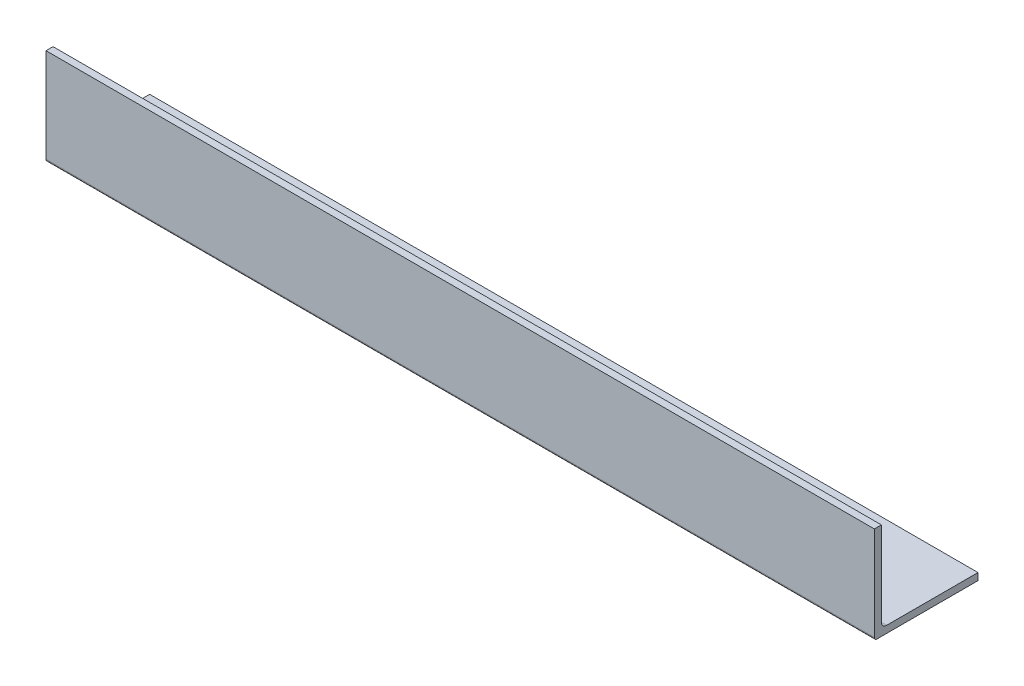
ISO-10303-21;
HEADER;
FILE_DESCRIPTION(('STEP AP214'),'2;1');
FILE_NAME('part.step','',(''),(''),'','','');
FILE_SCHEMA(('AUTOMOTIVE_DESIGN { 1 0 10303 214 1 1 1 1 }'));
ENDSEC;
DATA;
#1=APPLICATION_CONTEXT('core data for automotive mechanical design processes');
#2=APPLICATION_PROTOCOL_DEFINITION('international standard','automotive_design',2000,#1);
#3=PRODUCT_CONTEXT('',#1,'mechanical');
#4=PRODUCT('Part','Part','',(#3));
#5=PRODUCT_RELATED_PRODUCT_CATEGORY('part','',(#4));
#6=PRODUCT_DEFINITION_FORMATION('','',#4);
#7=PRODUCT_DEFINITION_CONTEXT('part definition',#1,'design');
#8=PRODUCT_DEFINITION('design','',#6,#7);
#9=PRODUCT_DEFINITION_SHAPE('','',#8);
#10=(LENGTH_UNIT() NAMED_UNIT(*) SI_UNIT(.MILLI.,.METRE.));
#11=(NAMED_UNIT(*) PLANE_ANGLE_UNIT() SI_UNIT($,.RADIAN.));
#12=(NAMED_UNIT(*) SI_UNIT($,.STERADIAN.) SOLID_ANGLE_UNIT());
#13=UNCERTAINTY_MEASURE_WITH_UNIT(LENGTH_MEASURE(1.E-05),#10,'distance_accuracy_value','');
#14=(GEOMETRIC_REPRESENTATION_CONTEXT(3) GLOBAL_UNCERTAINTY_ASSIGNED_CONTEXT((#13)) GLOBAL_UNIT_ASSIGNED_CONTEXT((#10,
#11,#12)) REPRESENTATION_CONTEXT('',''));
#15=CARTESIAN_POINT('',(0.,0.,0.));
#16=DIRECTION('',(0.,0.,1.));
#17=DIRECTION('',(1.,0.,0.));
#18=AXIS2_PLACEMENT_3D('',#15,#16,#17);
#19=CARTESIAN_POINT('',(-235.625,-27.5,0.));
#20=DIRECTION('',(0.,0.,1.));
#21=DIRECTION('',(1.,0.,0.));
#22=AXIS2_PLACEMENT_3D('',#19,#20,#21);
#23=PLANE('',#22);
#24=DIRECTION('',(0.,1.,0.));
#25=VECTOR('',#24,1.);
#26=CARTESIAN_POINT('',(235.625,27.5,0.));
#27=LINE('',#26,#25);
#28=CARTESIAN_POINT('',(235.625,-20.5,0.));
#29=VERTEX_POINT('',#28);
#30=CARTESIAN_POINT('',(235.625,27.5,0.));
#31=VERTEX_POINT('',#30);
#32=EDGE_CURVE('E135',#29,#31,#27,.T.);
#33=ORIENTED_EDGE('',*,*,#32,.F.);
#34=DIRECTION('',(1.,0.,0.));
#35=VECTOR('',#34,1.);
#36=CARTESIAN_POINT('',(-235.625,-20.5,0.));
#37=LINE('',#36,#35);
#38=CARTESIAN_POINT('',(-235.625,-20.5,0.));
#39=VERTEX_POINT('',#38);
#40=EDGE_CURVE('E147',#29,#39,#37,.F.);
#41=ORIENTED_EDGE('',*,*,#40,.T.);
#42=DIRECTION('',(0.,-1.,0.));
#43=VECTOR('',#42,1.);
#44=CARTESIAN_POINT('',(-235.625,27.5,0.));
#45=LINE('',#44,#43);
#46=CARTESIAN_POINT('',(-235.625,27.5,0.));
#47=VERTEX_POINT('',#46);
#48=EDGE_CURVE('E131',#47,#39,#45,.T.);
#49=ORIENTED_EDGE('',*,*,#48,.F.);
#50=DIRECTION('',(-1.,0.,0.));
#51=VECTOR('',#50,1.);
#52=CARTESIAN_POINT('',(-235.625,27.5,0.));
#53=LINE('',#52,#51);
#54=EDGE_CURVE('E121',#31,#47,#53,.T.);
#55=ORIENTED_EDGE('',*,*,#54,.F.);
#56=EDGE_LOOP('',(#33,#41,#49,#55));
#57=FACE_BOUND('',#56,.T.);
#58=ADVANCED_FACE('F31',(#57),#23,.F.);
#59=CARTESIAN_POINT('',(-235.625,27.5,4.));
#60=DIRECTION('',(1.,0.,0.));
#61=DIRECTION('',(0.,0.,-1.));
#62=AXIS2_PLACEMENT_3D('',#59,#60,#61);
#63=PLANE('',#62);
#64=DIRECTION('',(0.,0.,-1.));
#65=VECTOR('',#64,1.);
#66=CARTESIAN_POINT('',(-235.625,-27.5,4.));
#67=LINE('',#66,#65);
#68=CARTESIAN_POINT('',(-235.625,-27.5,2.5));
#69=VERTEX_POINT('',#68);
#70=CARTESIAN_POINT('',(-235.625,-27.5,-55.));
#71=VERTEX_POINT('',#70);
#72=EDGE_CURVE('E98',#69,#71,#67,.T.);
#73=ORIENTED_EDGE('',*,*,#72,.F.);
#74=CARTESIAN_POINT('',(-235.625,-26.,2.5));
#75=DIRECTION('',(1.,0.,0.));
#76=DIRECTION('',(0.,0.,-1.));
#77=AXIS2_PLACEMENT_3D('',#74,#75,#76);
#78=CIRCLE('',#77,1.5);
#79=CARTESIAN_POINT('',(-235.625,-26.,4.));
#80=VERTEX_POINT('',#79);
#81=EDGE_CURVE('E11',#69,#80,#78,.F.);
#82=ORIENTED_EDGE('',*,*,#81,.T.);
#83=DIRECTION('',(0.,-1.,0.));
#84=VECTOR('',#83,1.);
#85=CARTESIAN_POINT('',(-235.625,27.5,4.));
#86=LINE('',#85,#84);
#87=CARTESIAN_POINT('',(-235.625,27.5,4.));
#88=VERTEX_POINT('',#87);
#89=EDGE_CURVE('E117',#88,#80,#86,.T.);
#90=ORIENTED_EDGE('',*,*,#89,.F.);
#91=DIRECTION('',(0.,0.,-1.));
#92=VECTOR('',#91,1.);
#93=CARTESIAN_POINT('',(-235.625,27.5,4.));
#94=LINE('',#93,#92);
#95=EDGE_CURVE('E125',#88,#47,#94,.T.);
#96=ORIENTED_EDGE('',*,*,#95,.T.);
#97=ORIENTED_EDGE('',*,*,#48,.T.);
#98=CARTESIAN_POINT('',(-235.625,-20.5,-3.));
#99=DIRECTION('',(1.,0.,0.));
#100=DIRECTION('',(0.,0.,-1.));
#101=AXIS2_PLACEMENT_3D('',#98,#99,#100);
#102=CIRCLE('',#101,3.);
#103=CARTESIAN_POINT('',(-235.625,-23.5,-3.));
#104=VERTEX_POINT('',#103);
#105=EDGE_CURVE('E152',#39,#104,#102,.T.);
#106=ORIENTED_EDGE('',*,*,#105,.T.);
#107=DIRECTION('',(0.,0.,1.));
#108=VECTOR('',#107,1.);
#109=CARTESIAN_POINT('',(-235.625,-23.5,-55.));
#110=LINE('',#109,#108);
#111=CARTESIAN_POINT('',(-235.625,-23.5,-55.));
#112=VERTEX_POINT('',#111);
#113=EDGE_CURVE('E136',#112,#104,#110,.T.);
#114=ORIENTED_EDGE('',*,*,#113,.F.);
#115=DIRECTION('',(0.,1.,0.));
#116=VECTOR('',#115,1.);
#117=CARTESIAN_POINT('',(-235.625,-23.5,-55.));
#118=LINE('',#117,#116);
#119=EDGE_CURVE('E106',#71,#112,#118,.T.);
#120=ORIENTED_EDGE('',*,*,#119,.F.);
#121=EDGE_LOOP('',(#73,#82,#90,#96,#97,#106,#114,#120));
#122=FACE_BOUND('',#121,.T.);
#123=ADVANCED_FACE('F176',(#122),#63,.F.);
#124=CARTESIAN_POINT('',(-235.625,-27.5,4.));
#125=DIRECTION('',(0.,1.,0.));
#126=DIRECTION('',(0.,0.,1.));
#127=AXIS2_PLACEMENT_3D('',#124,#125,#126);
#128=PLANE('',#127);
#129=DIRECTION('',(0.,0.,-1.));
#130=VECTOR('',#129,1.);
#131=CARTESIAN_POINT('',(235.625,-27.5,4.));
#132=LINE('',#131,#130);
#133=CARTESIAN_POINT('',(235.625,-27.5,2.5));
#134=VERTEX_POINT('',#133);
#135=CARTESIAN_POINT('',(235.625,-27.5,-55.));
#136=VERTEX_POINT('',#135);
#137=EDGE_CURVE('E92',#134,#136,#132,.T.);
#138=ORIENTED_EDGE('',*,*,#137,.F.);
#139=DIRECTION('',(1.,0.,0.));
#140=VECTOR('',#139,1.);
#141=CARTESIAN_POINT('',(-235.625,-27.5,2.5));
#142=LINE('',#141,#140);
#143=EDGE_CURVE('E39',#134,#69,#142,.F.);
#144=ORIENTED_EDGE('',*,*,#143,.T.);
#145=ORIENTED_EDGE('',*,*,#72,.T.);
#146=DIRECTION('',(-1.,0.,0.));
#147=VECTOR('',#146,1.);
#148=CARTESIAN_POINT('',(235.625,-27.5,-55.));
#149=LINE('',#148,#147);
#150=EDGE_CURVE('E102',#136,#71,#149,.T.);
#151=ORIENTED_EDGE('',*,*,#150,.F.);
#152=EDGE_LOOP('',(#138,#144,#145,#151));
#153=FACE_BOUND('',#152,.T.);
#154=ADVANCED_FACE('F103',(#153),#128,.F.);
#155=CARTESIAN_POINT('',(235.625,27.5,4.));
#156=DIRECTION('',(-1.,0.,0.));
#157=DIRECTION('',(0.,0.,1.));
#158=AXIS2_PLACEMENT_3D('',#155,#156,#157);
#159=PLANE('',#158);
#160=DIRECTION('',(0.,1.,0.));
#161=VECTOR('',#160,1.);
#162=CARTESIAN_POINT('',(235.625,27.5,4.));
#163=LINE('',#162,#161);
#164=CARTESIAN_POINT('',(235.625,-26.,4.));
#165=VERTEX_POINT('',#164);
#166=CARTESIAN_POINT('',(235.625,27.5,4.));
#167=VERTEX_POINT('',#166);
#168=EDGE_CURVE('E120',#165,#167,#163,.T.);
#169=ORIENTED_EDGE('',*,*,#168,.F.);
#170=CARTESIAN_POINT('',(235.625,-26.,2.5));
#171=DIRECTION('',(-1.,0.,0.));
#172=DIRECTION('',(0.,0.,1.));
#173=AXIS2_PLACEMENT_3D('',#170,#171,#172);
#174=CIRCLE('',#173,1.5);
#175=EDGE_CURVE('E53',#165,#134,#174,.F.);
#176=ORIENTED_EDGE('',*,*,#175,.T.);
#177=ORIENTED_EDGE('',*,*,#137,.T.);
#178=DIRECTION('',(0.,-1.,0.));
#179=VECTOR('',#178,1.);
#180=CARTESIAN_POINT('',(235.625,-23.5,-55.));
#181=LINE('',#180,#179);
#182=CARTESIAN_POINT('',(235.625,-23.5,-55.));
#183=VERTEX_POINT('',#182);
#184=EDGE_CURVE('E97',#183,#136,#181,.T.);
#185=ORIENTED_EDGE('',*,*,#184,.F.);
#186=DIRECTION('',(0.,0.,1.));
#187=VECTOR('',#186,1.);
#188=CARTESIAN_POINT('',(235.625,-23.5,-55.));
#189=LINE('',#188,#187);
#190=CARTESIAN_POINT('',(235.625,-23.5,-3.));
#191=VERTEX_POINT('',#190);
#192=EDGE_CURVE('E116',#183,#191,#189,.T.);
#193=ORIENTED_EDGE('',*,*,#192,.T.);
#194=CARTESIAN_POINT('',(235.625,-20.5,-3.));
#195=DIRECTION('',(-1.,0.,0.));
#196=DIRECTION('',(0.,0.,1.));
#197=AXIS2_PLACEMENT_3D('',#194,#195,#196);
#198=CIRCLE('',#197,3.);
#199=EDGE_CURVE('E150',#191,#29,#198,.T.);
#200=ORIENTED_EDGE('',*,*,#199,.T.);
#201=ORIENTED_EDGE('',*,*,#32,.T.);
#202=DIRECTION('',(0.,0.,-1.));
#203=VECTOR('',#202,1.);
#204=CARTESIAN_POINT('',(235.625,27.5,4.));
#205=LINE('',#204,#203);
#206=EDGE_CURVE('E99',#167,#31,#205,.T.);
#207=ORIENTED_EDGE('',*,*,#206,.F.);
#208=EDGE_LOOP('',(#169,#176,#177,#185,#193,#200,#201,#207));
#209=FACE_BOUND('',#208,.T.);
#210=ADVANCED_FACE('F94',(#209),#159,.F.);
#211=CARTESIAN_POINT('',(-235.625,27.5,4.));
#212=DIRECTION('',(0.,-1.,0.));
#213=DIRECTION('',(0.,0.,-1.));
#214=AXIS2_PLACEMENT_3D('',#211,#212,#213);
#215=PLANE('',#214);
#216=ORIENTED_EDGE('',*,*,#54,.T.);
#217=ORIENTED_EDGE('',*,*,#95,.F.);
#218=DIRECTION('',(-1.,0.,0.));
#219=VECTOR('',#218,1.);
#220=CARTESIAN_POINT('',(-235.625,27.5,4.));
#221=LINE('',#220,#219);
#222=EDGE_CURVE('E123',#167,#88,#221,.T.);
#223=ORIENTED_EDGE('',*,*,#222,.F.);
#224=ORIENTED_EDGE('',*,*,#206,.T.);
#225=EDGE_LOOP('',(#216,#217,#223,#224));
#226=FACE_BOUND('',#225,.T.);
#227=ADVANCED_FACE('F171',(#226),#215,.F.);
#228=CARTESIAN_POINT('',(-235.625,-27.5,4.));
#229=DIRECTION('',(0.,0.,1.));
#230=DIRECTION('',(1.,0.,0.));
#231=AXIS2_PLACEMENT_3D('',#228,#229,#230);
#232=PLANE('',#231);
#233=ORIENTED_EDGE('',*,*,#89,.T.);
#234=DIRECTION('',(1.,0.,0.));
#235=VECTOR('',#234,1.);
#236=CARTESIAN_POINT('',(235.625,-26.,4.));
#237=LINE('',#236,#235);
#238=EDGE_CURVE('E154',#80,#165,#237,.T.);
#239=ORIENTED_EDGE('',*,*,#238,.T.);
#240=ORIENTED_EDGE('',*,*,#168,.T.);
#241=ORIENTED_EDGE('',*,*,#222,.T.);
#242=EDGE_LOOP('',(#233,#239,#240,#241));
#243=FACE_BOUND('',#242,.T.);
#244=ADVANCED_FACE('F159',(#243),#232,.T.);
#245=CARTESIAN_POINT('',(235.625,-23.5,-55.));
#246=DIRECTION('',(0.,-1.,0.));
#247=DIRECTION('',(0.,0.,-1.));
#248=AXIS2_PLACEMENT_3D('',#245,#246,#247);
#249=PLANE('',#248);
#250=ORIENTED_EDGE('',*,*,#113,.T.);
#251=DIRECTION('',(1.,0.,0.));
#252=VECTOR('',#251,1.);
#253=CARTESIAN_POINT('',(235.625,-23.5,-3.));
#254=LINE('',#253,#252);
#255=EDGE_CURVE('E144',#104,#191,#254,.T.);
#256=ORIENTED_EDGE('',*,*,#255,.T.);
#257=ORIENTED_EDGE('',*,*,#192,.F.);
#258=DIRECTION('',(1.,0.,0.));
#259=VECTOR('',#258,1.);
#260=CARTESIAN_POINT('',(235.625,-23.5,-55.));
#261=LINE('',#260,#259);
#262=EDGE_CURVE('E110',#112,#183,#261,.T.);
#263=ORIENTED_EDGE('',*,*,#262,.F.);
#264=EDGE_LOOP('',(#250,#256,#257,#263));
#265=FACE_BOUND('',#264,.T.);
#266=ADVANCED_FACE('F217',(#265),#249,.F.);
#267=CARTESIAN_POINT('',(235.625,-27.5,-55.));
#268=DIRECTION('',(0.,0.,-1.));
#269=DIRECTION('',(-1.,0.,0.));
#270=AXIS2_PLACEMENT_3D('',#267,#268,#269);
#271=PLANE('',#270);
#272=ORIENTED_EDGE('',*,*,#184,.T.);
#273=ORIENTED_EDGE('',*,*,#150,.T.);
#274=ORIENTED_EDGE('',*,*,#119,.T.);
#275=ORIENTED_EDGE('',*,*,#262,.T.);
#276=EDGE_LOOP('',(#272,#273,#274,#275));
#277=FACE_BOUND('',#276,.T.);
#278=ADVANCED_FACE('F108',(#277),#271,.T.);
#279=CARTESIAN_POINT('',(235.625,-20.5,-3.));
#280=DIRECTION('',(-1.,0.,0.));
#281=DIRECTION('',(0.,0.,1.));
#282=AXIS2_PLACEMENT_3D('',#279,#280,#281);
#283=CYLINDRICAL_SURFACE('',#282,3.);
#284=ORIENTED_EDGE('',*,*,#105,.F.);
#285=ORIENTED_EDGE('',*,*,#40,.F.);
#286=ORIENTED_EDGE('',*,*,#199,.F.);
#287=ORIENTED_EDGE('',*,*,#255,.F.);
#288=EDGE_LOOP('',(#284,#285,#286,#287));
#289=FACE_BOUND('',#288,.T.);
#290=ADVANCED_FACE('F178',(#289),#283,.F.);
#291=CARTESIAN_POINT('',(-235.625,-26.,2.5));
#292=DIRECTION('',(-1.,0.,0.));
#293=DIRECTION('',(0.,0.,1.));
#294=AXIS2_PLACEMENT_3D('',#291,#292,#293);
#295=CYLINDRICAL_SURFACE('',#294,1.5);
#296=ORIENTED_EDGE('',*,*,#81,.F.);
#297=ORIENTED_EDGE('',*,*,#143,.F.);
#298=ORIENTED_EDGE('',*,*,#175,.F.);
#299=ORIENTED_EDGE('',*,*,#238,.F.);
#300=EDGE_LOOP('',(#296,#297,#298,#299));
#301=FACE_BOUND('',#300,.T.);
#302=ADVANCED_FACE('F33',(#301),#295,.T.);
#303=CLOSED_SHELL('',(#58,#123,#154,#210,#227,#244,#266,#278,#290,#302));
#304=MANIFOLD_SOLID_BREP('B2',#303);
#305=ADVANCED_BREP_SHAPE_REPRESENTATION('',(#18,#304),#14);
#306=SHAPE_DEFINITION_REPRESENTATION(#9,#305);
ENDSEC;
END-ISO-10303-21;
